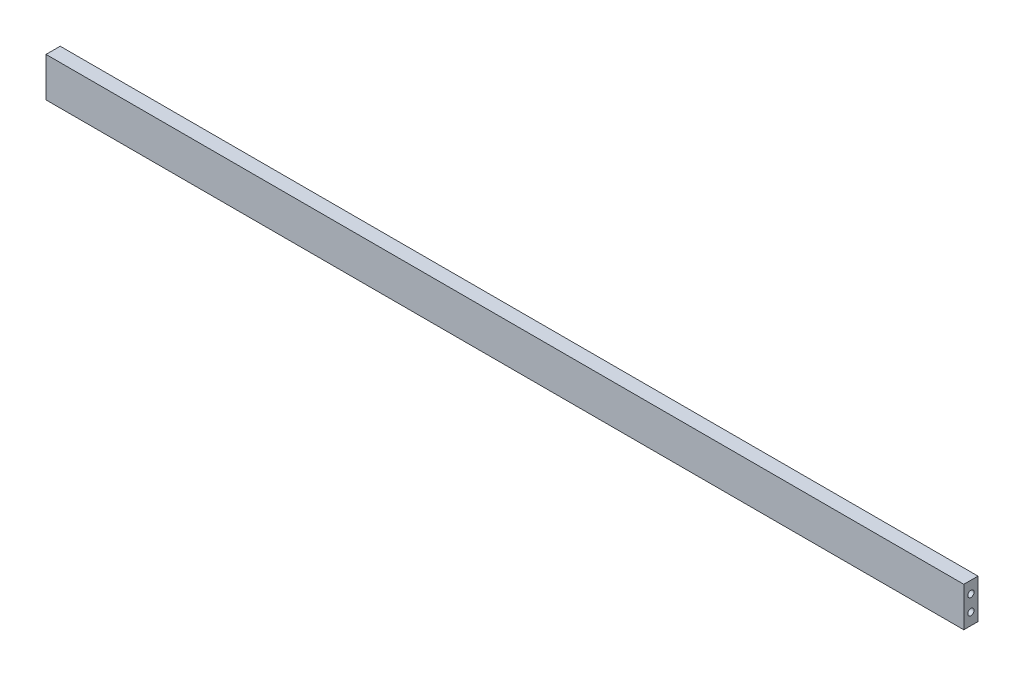
ISO-10303-21;
HEADER;
FILE_DESCRIPTION(('STEP AP214'),'2;1');
FILE_NAME('part.step','',(''),(''),'','','');
FILE_SCHEMA(('AUTOMOTIVE_DESIGN { 1 0 10303 214 1 1 1 1 }'));
ENDSEC;
DATA;
#1=APPLICATION_CONTEXT('core data for automotive mechanical design processes');
#2=APPLICATION_PROTOCOL_DEFINITION('international standard','automotive_design',2000,#1);
#3=PRODUCT_CONTEXT('',#1,'mechanical');
#4=PRODUCT('Part','Part','',(#3));
#5=PRODUCT_RELATED_PRODUCT_CATEGORY('part','',(#4));
#6=PRODUCT_DEFINITION_FORMATION('','',#4);
#7=PRODUCT_DEFINITION_CONTEXT('part definition',#1,'design');
#8=PRODUCT_DEFINITION('design','',#6,#7);
#9=PRODUCT_DEFINITION_SHAPE('','',#8);
#10=(LENGTH_UNIT() NAMED_UNIT(*) SI_UNIT(.MILLI.,.METRE.));
#11=(NAMED_UNIT(*) PLANE_ANGLE_UNIT() SI_UNIT($,.RADIAN.));
#12=(NAMED_UNIT(*) SI_UNIT($,.STERADIAN.) SOLID_ANGLE_UNIT());
#13=UNCERTAINTY_MEASURE_WITH_UNIT(LENGTH_MEASURE(1.E-05),#10,'distance_accuracy_value','');
#14=(GEOMETRIC_REPRESENTATION_CONTEXT(3) GLOBAL_UNCERTAINTY_ASSIGNED_CONTEXT((#13)) GLOBAL_UNIT_ASSIGNED_CONTEXT((#10,
#11,#12)) REPRESENTATION_CONTEXT('',''));
#15=CARTESIAN_POINT('',(0.,0.,0.));
#16=DIRECTION('',(0.,0.,1.));
#17=DIRECTION('',(1.,0.,0.));
#18=AXIS2_PLACEMENT_3D('',#15,#16,#17);
#19=CARTESIAN_POINT('',(-1164.,1164.13916693839,-18.));
#20=DIRECTION('',(1.,0.,0.));
#21=DIRECTION('',(0.,0.,-1.));
#22=AXIS2_PLACEMENT_3D('',#19,#20,#21);
#23=PLANE('',#22);
#24=CARTESIAN_POINT('',(-1164.,-35.,-9.00000000000009));
#25=DIRECTION('',(1.,0.,0.));
#26=DIRECTION('',(0.,0.,-1.));
#27=AXIS2_PLACEMENT_3D('',#24,#25,#26);
#28=CIRCLE('',#27,4.);
#29=CARTESIAN_POINT('',(-1164.,-35.,-13.0000000000001));
#30=VERTEX_POINT('',#29);
#31=EDGE_CURVE('E121',#30,#30,#28,.T.);
#32=ORIENTED_EDGE('',*,*,#31,.T.);
#33=EDGE_LOOP('',(#32));
#34=FACE_BOUND('',#33,.T.);
#35=DIRECTION('',(0.,0.,1.));
#36=VECTOR('',#35,1.);
#37=CARTESIAN_POINT('',(-1164.,0.,-18.));
#38=LINE('',#37,#36);
#39=CARTESIAN_POINT('',(-1164.,0.,-18.));
#40=VERTEX_POINT('',#39);
#41=CARTESIAN_POINT('',(-1164.,0.,0.));
#42=VERTEX_POINT('',#41);
#43=EDGE_CURVE('E85',#40,#42,#38,.T.);
#44=ORIENTED_EDGE('',*,*,#43,.F.);
#45=DIRECTION('',(0.,-1.,0.));
#46=VECTOR('',#45,1.);
#47=CARTESIAN_POINT('',(-1164.,1164.13916693839,-18.));
#48=LINE('',#47,#46);
#49=CARTESIAN_POINT('',(-1164.,-50.,-18.));
#50=VERTEX_POINT('',#49);
#51=EDGE_CURVE('E38',#40,#50,#48,.T.);
#52=ORIENTED_EDGE('',*,*,#51,.T.);
#53=DIRECTION('',(0.,0.,1.));
#54=VECTOR('',#53,1.);
#55=CARTESIAN_POINT('',(-1164.,-50.,-18.));
#56=LINE('',#55,#54);
#57=CARTESIAN_POINT('',(-1164.,-50.,0.));
#58=VERTEX_POINT('',#57);
#59=EDGE_CURVE('E83',#50,#58,#56,.T.);
#60=ORIENTED_EDGE('',*,*,#59,.T.);
#61=DIRECTION('',(0.,-1.,0.));
#62=VECTOR('',#61,1.);
#63=CARTESIAN_POINT('',(-1164.,1164.13916693839,0.));
#64=LINE('',#63,#62);
#65=EDGE_CURVE('E73',#42,#58,#64,.T.);
#66=ORIENTED_EDGE('',*,*,#65,.F.);
#67=EDGE_LOOP('',(#44,#52,#60,#66));
#68=FACE_BOUND('',#67,.T.);
#69=CARTESIAN_POINT('',(-1164.,-15.,-9.00000000000009));
#70=DIRECTION('',(1.,0.,0.));
#71=DIRECTION('',(0.,0.,-1.));
#72=AXIS2_PLACEMENT_3D('',#69,#70,#71);
#73=CIRCLE('',#72,4.);
#74=CARTESIAN_POINT('',(-1164.,-15.,-13.0000000000001));
#75=VERTEX_POINT('',#74);
#76=EDGE_CURVE('E127',#75,#75,#73,.T.);
#77=ORIENTED_EDGE('',*,*,#76,.T.);
#78=EDGE_LOOP('',(#77));
#79=FACE_BOUND('',#78,.T.);
#80=ADVANCED_FACE('F34',(#34,#68,#79),#23,.F.);
#81=CARTESIAN_POINT('',(-1164.,1164.13916693839,0.));
#82=DIRECTION('',(0.,0.,-1.));
#83=DIRECTION('',(-1.,0.,0.));
#84=AXIS2_PLACEMENT_3D('',#81,#82,#83);
#85=PLANE('',#84);
#86=DIRECTION('',(1.,0.,0.));
#87=VECTOR('',#86,1.);
#88=CARTESIAN_POINT('',(-1164.,0.,0.));
#89=LINE('',#88,#87);
#90=CARTESIAN_POINT('',(0.,0.,0.));
#91=VERTEX_POINT('',#90);
#92=EDGE_CURVE('E43',#42,#91,#89,.T.);
#93=ORIENTED_EDGE('',*,*,#92,.F.);
#94=ORIENTED_EDGE('',*,*,#65,.T.);
#95=DIRECTION('',(1.,0.,0.));
#96=VECTOR('',#95,1.);
#97=CARTESIAN_POINT('',(-1164.,-50.,0.));
#98=LINE('',#97,#96);
#99=CARTESIAN_POINT('',(0.,-50.,0.));
#100=VERTEX_POINT('',#99);
#101=EDGE_CURVE('E96',#58,#100,#98,.T.);
#102=ORIENTED_EDGE('',*,*,#101,.T.);
#103=DIRECTION('',(0.,-1.,0.));
#104=VECTOR('',#103,1.);
#105=CARTESIAN_POINT('',(0.,1164.13916693839,0.));
#106=LINE('',#105,#104);
#107=EDGE_CURVE('E105',#91,#100,#106,.T.);
#108=ORIENTED_EDGE('',*,*,#107,.F.);
#109=EDGE_LOOP('',(#93,#94,#102,#108));
#110=FACE_BOUND('',#109,.T.);
#111=ADVANCED_FACE('F145',(#110),#85,.F.);
#112=CARTESIAN_POINT('',(0.,1164.13916693839,-18.0000000000001));
#113=DIRECTION('',(-1.,0.,0.));
#114=DIRECTION('',(0.,0.,1.));
#115=AXIS2_PLACEMENT_3D('',#112,#113,#114);
#116=PLANE('',#115);
#117=CARTESIAN_POINT('',(0.,-35.,-9.00000000000009));
#118=DIRECTION('',(1.,0.,0.));
#119=DIRECTION('',(0.,0.,-1.));
#120=AXIS2_PLACEMENT_3D('',#117,#118,#119);
#121=CIRCLE('',#120,4.);
#122=CARTESIAN_POINT('',(0.,-35.,-13.0000000000001));
#123=VERTEX_POINT('',#122);
#124=EDGE_CURVE('E115',#123,#123,#121,.T.);
#125=ORIENTED_EDGE('',*,*,#124,.F.);
#126=EDGE_LOOP('',(#125));
#127=FACE_BOUND('',#126,.T.);
#128=CARTESIAN_POINT('',(0.,-15.,-9.00000000000009));
#129=DIRECTION('',(1.,0.,0.));
#130=DIRECTION('',(0.,0.,-1.));
#131=AXIS2_PLACEMENT_3D('',#128,#129,#130);
#132=CIRCLE('',#131,4.);
#133=CARTESIAN_POINT('',(0.,-15.,-13.0000000000001));
#134=VERTEX_POINT('',#133);
#135=EDGE_CURVE('E109',#134,#134,#132,.T.);
#136=ORIENTED_EDGE('',*,*,#135,.F.);
#137=EDGE_LOOP('',(#136));
#138=FACE_BOUND('',#137,.T.);
#139=DIRECTION('',(0.,0.,-1.));
#140=VECTOR('',#139,1.);
#141=CARTESIAN_POINT('',(0.,0.,-18.0000000000001));
#142=LINE('',#141,#140);
#143=CARTESIAN_POINT('',(0.,0.,-18.0000000000001));
#144=VERTEX_POINT('',#143);
#145=EDGE_CURVE('E11',#91,#144,#142,.T.);
#146=ORIENTED_EDGE('',*,*,#145,.F.);
#147=ORIENTED_EDGE('',*,*,#107,.T.);
#148=DIRECTION('',(0.,0.,-1.));
#149=VECTOR('',#148,1.);
#150=CARTESIAN_POINT('',(0.,-50.,-18.0000000000001));
#151=LINE('',#150,#149);
#152=CARTESIAN_POINT('',(0.,-50.,-18.0000000000001));
#153=VERTEX_POINT('',#152);
#154=EDGE_CURVE('E106',#100,#153,#151,.T.);
#155=ORIENTED_EDGE('',*,*,#154,.T.);
#156=DIRECTION('',(0.,-1.,0.));
#157=VECTOR('',#156,1.);
#158=CARTESIAN_POINT('',(0.,1164.13916693839,-18.0000000000001));
#159=LINE('',#158,#157);
#160=EDGE_CURVE('E56',#144,#153,#159,.T.);
#161=ORIENTED_EDGE('',*,*,#160,.F.);
#162=EDGE_LOOP('',(#146,#147,#155,#161));
#163=FACE_BOUND('',#162,.T.);
#164=ADVANCED_FACE('F150',(#127,#138,#163),#116,.F.);
#165=CARTESIAN_POINT('',(-1164.,1164.13916693839,-18.));
#166=DIRECTION('',(0.,0.,1.));
#167=DIRECTION('',(1.,0.,0.));
#168=AXIS2_PLACEMENT_3D('',#165,#166,#167);
#169=PLANE('',#168);
#170=DIRECTION('',(-1.,0.,0.));
#171=VECTOR('',#170,1.);
#172=CARTESIAN_POINT('',(-1164.,0.,-18.));
#173=LINE('',#172,#171);
#174=EDGE_CURVE('E93',#144,#40,#173,.T.);
#175=ORIENTED_EDGE('',*,*,#174,.F.);
#176=ORIENTED_EDGE('',*,*,#160,.T.);
#177=DIRECTION('',(-1.,0.,0.));
#178=VECTOR('',#177,1.);
#179=CARTESIAN_POINT('',(-1164.,-50.,-18.));
#180=LINE('',#179,#178);
#181=EDGE_CURVE('E89',#153,#50,#180,.T.);
#182=ORIENTED_EDGE('',*,*,#181,.T.);
#183=ORIENTED_EDGE('',*,*,#51,.F.);
#184=EDGE_LOOP('',(#175,#176,#182,#183));
#185=FACE_BOUND('',#184,.T.);
#186=ADVANCED_FACE('F90',(#185),#169,.F.);
#187=CARTESIAN_POINT('',(-1164.,-50.,0.));
#188=DIRECTION('',(0.,1.,0.));
#189=DIRECTION('',(0.,0.,1.));
#190=AXIS2_PLACEMENT_3D('',#187,#188,#189);
#191=PLANE('',#190);
#192=ORIENTED_EDGE('',*,*,#59,.F.);
#193=ORIENTED_EDGE('',*,*,#181,.F.);
#194=ORIENTED_EDGE('',*,*,#154,.F.);
#195=ORIENTED_EDGE('',*,*,#101,.F.);
#196=EDGE_LOOP('',(#192,#193,#194,#195));
#197=FACE_BOUND('',#196,.T.);
#198=ADVANCED_FACE('F95',(#197),#191,.F.);
#199=CARTESIAN_POINT('',(0.,0.,0.));
#200=DIRECTION('',(0.,1.,0.));
#201=DIRECTION('',(0.,0.,1.));
#202=AXIS2_PLACEMENT_3D('',#199,#200,#201);
#203=PLANE('',#202);
#204=ORIENTED_EDGE('',*,*,#174,.T.);
#205=ORIENTED_EDGE('',*,*,#43,.T.);
#206=ORIENTED_EDGE('',*,*,#92,.T.);
#207=ORIENTED_EDGE('',*,*,#145,.T.);
#208=EDGE_LOOP('',(#204,#205,#206,#207));
#209=FACE_BOUND('',#208,.T.);
#210=ADVANCED_FACE('F36',(#209),#203,.T.);
#211=CARTESIAN_POINT('',(-10.,-15.,-9.00000000000009));
#212=DIRECTION('',(1.,0.,0.));
#213=DIRECTION('',(0.,0.,-1.));
#214=AXIS2_PLACEMENT_3D('',#211,#212,#213);
#215=CYLINDRICAL_SURFACE('',#214,4.);
#216=CARTESIAN_POINT('',(-10.,-15.,-9.00000000000009));
#217=DIRECTION('',(1.,0.,0.));
#218=DIRECTION('',(0.,0.,-1.));
#219=AXIS2_PLACEMENT_3D('',#216,#217,#218);
#220=CIRCLE('',#219,4.);
#221=CARTESIAN_POINT('',(-10.,-15.,-13.0000000000001));
#222=VERTEX_POINT('',#221);
#223=EDGE_CURVE('E87',#222,#222,#220,.T.);
#224=ORIENTED_EDGE('',*,*,#223,.F.);
#225=EDGE_LOOP('',(#224));
#226=FACE_BOUND('',#225,.T.);
#227=ORIENTED_EDGE('',*,*,#135,.T.);
#228=EDGE_LOOP('',(#227));
#229=FACE_BOUND('',#228,.T.);
#230=ADVANCED_FACE('F160',(#226,#229),#215,.F.);
#231=CARTESIAN_POINT('',(-10.,-15.,-9.00000000000009));
#232=DIRECTION('',(1.,0.,0.));
#233=DIRECTION('',(0.,0.,-1.));
#234=AXIS2_PLACEMENT_3D('',#231,#232,#233);
#235=PLANE('',#234);
#236=ORIENTED_EDGE('',*,*,#223,.T.);
#237=EDGE_LOOP('',(#236));
#238=FACE_BOUND('',#237,.T.);
#239=ADVANCED_FACE('F163',(#238),#235,.T.);
#240=CARTESIAN_POINT('',(-10.,-35.,-9.00000000000009));
#241=DIRECTION('',(1.,0.,0.));
#242=DIRECTION('',(0.,0.,-1.));
#243=AXIS2_PLACEMENT_3D('',#240,#241,#242);
#244=CYLINDRICAL_SURFACE('',#243,4.);
#245=CARTESIAN_POINT('',(-10.,-35.,-9.00000000000009));
#246=DIRECTION('',(1.,0.,0.));
#247=DIRECTION('',(0.,0.,-1.));
#248=AXIS2_PLACEMENT_3D('',#245,#246,#247);
#249=CIRCLE('',#248,4.);
#250=CARTESIAN_POINT('',(-10.,-35.,-13.0000000000001));
#251=VERTEX_POINT('',#250);
#252=EDGE_CURVE('E112',#251,#251,#249,.T.);
#253=ORIENTED_EDGE('',*,*,#252,.F.);
#254=EDGE_LOOP('',(#253));
#255=FACE_BOUND('',#254,.T.);
#256=ORIENTED_EDGE('',*,*,#124,.T.);
#257=EDGE_LOOP('',(#256));
#258=FACE_BOUND('',#257,.T.);
#259=ADVANCED_FACE('F167',(#255,#258),#244,.F.);
#260=CARTESIAN_POINT('',(-10.,-35.,-9.00000000000009));
#261=DIRECTION('',(1.,0.,0.));
#262=DIRECTION('',(0.,0.,-1.));
#263=AXIS2_PLACEMENT_3D('',#260,#261,#262);
#264=PLANE('',#263);
#265=ORIENTED_EDGE('',*,*,#252,.T.);
#266=EDGE_LOOP('',(#265));
#267=FACE_BOUND('',#266,.T.);
#268=ADVANCED_FACE('F171',(#267),#264,.T.);
#269=CARTESIAN_POINT('',(-1154.,-35.,-9.00000000000009));
#270=DIRECTION('',(-1.,0.,0.));
#271=DIRECTION('',(0.,0.,1.));
#272=AXIS2_PLACEMENT_3D('',#269,#270,#271);
#273=CYLINDRICAL_SURFACE('',#272,4.);
#274=CARTESIAN_POINT('',(-1154.,-35.,-9.00000000000009));
#275=DIRECTION('',(1.,0.,0.));
#276=DIRECTION('',(0.,0.,-1.));
#277=AXIS2_PLACEMENT_3D('',#274,#275,#276);
#278=CIRCLE('',#277,4.);
#279=CARTESIAN_POINT('',(-1154.,-35.,-13.0000000000001));
#280=VERTEX_POINT('',#279);
#281=EDGE_CURVE('E118',#280,#280,#278,.T.);
#282=ORIENTED_EDGE('',*,*,#281,.T.);
#283=EDGE_LOOP('',(#282));
#284=FACE_BOUND('',#283,.T.);
#285=ORIENTED_EDGE('',*,*,#31,.F.);
#286=EDGE_LOOP('',(#285));
#287=FACE_BOUND('',#286,.T.);
#288=ADVANCED_FACE('F175',(#284,#287),#273,.F.);
#289=CARTESIAN_POINT('',(-1154.,-35.,-9.00000000000009));
#290=DIRECTION('',(1.,0.,0.));
#291=DIRECTION('',(0.,0.,-1.));
#292=AXIS2_PLACEMENT_3D('',#289,#290,#291);
#293=PLANE('',#292);
#294=ORIENTED_EDGE('',*,*,#281,.F.);
#295=EDGE_LOOP('',(#294));
#296=FACE_BOUND('',#295,.T.);
#297=ADVANCED_FACE('F142',(#296),#293,.F.);
#298=CARTESIAN_POINT('',(-1154.,-15.,-9.00000000000009));
#299=DIRECTION('',(-1.,0.,0.));
#300=DIRECTION('',(0.,0.,1.));
#301=AXIS2_PLACEMENT_3D('',#298,#299,#300);
#302=CYLINDRICAL_SURFACE('',#301,4.);
#303=CARTESIAN_POINT('',(-1154.,-15.,-9.00000000000009));
#304=DIRECTION('',(1.,0.,0.));
#305=DIRECTION('',(0.,0.,-1.));
#306=AXIS2_PLACEMENT_3D('',#303,#304,#305);
#307=CIRCLE('',#306,4.);
#308=CARTESIAN_POINT('',(-1154.,-15.,-13.0000000000001));
#309=VERTEX_POINT('',#308);
#310=EDGE_CURVE('E124',#309,#309,#307,.T.);
#311=ORIENTED_EDGE('',*,*,#310,.T.);
#312=EDGE_LOOP('',(#311));
#313=FACE_BOUND('',#312,.T.);
#314=ORIENTED_EDGE('',*,*,#76,.F.);
#315=EDGE_LOOP('',(#314));
#316=FACE_BOUND('',#315,.T.);
#317=ADVANCED_FACE('F133',(#313,#316),#302,.F.);
#318=CARTESIAN_POINT('',(-1154.,-15.,-9.00000000000009));
#319=DIRECTION('',(1.,0.,0.));
#320=DIRECTION('',(0.,0.,-1.));
#321=AXIS2_PLACEMENT_3D('',#318,#319,#320);
#322=PLANE('',#321);
#323=ORIENTED_EDGE('',*,*,#310,.F.);
#324=EDGE_LOOP('',(#323));
#325=FACE_BOUND('',#324,.T.);
#326=ADVANCED_FACE('F136',(#325),#322,.F.);
#327=CLOSED_SHELL('',(#80,#111,#164,#186,#198,#210,#230,#239,#259,#268,#288,#297,#317,#326));
#328=MANIFOLD_SOLID_BREP('B2',#327);
#329=ADVANCED_BREP_SHAPE_REPRESENTATION('',(#18,#328),#14);
#330=SHAPE_DEFINITION_REPRESENTATION(#9,#329);
ENDSEC;
END-ISO-10303-21;
